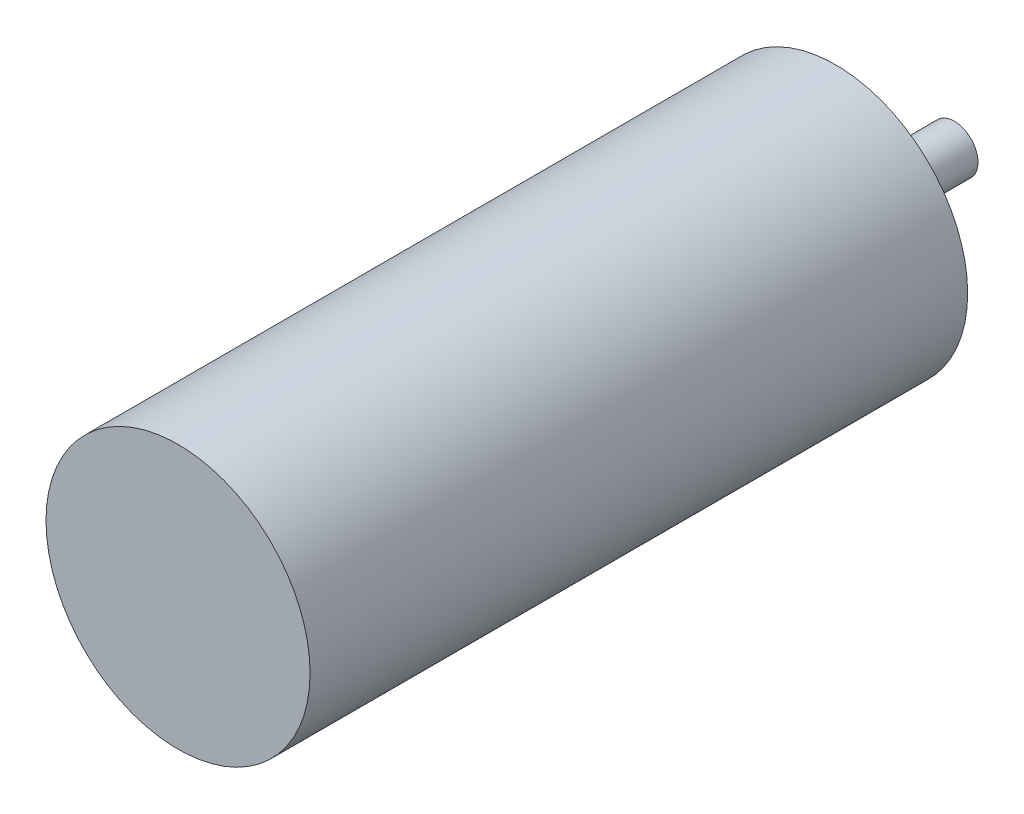
ISO-10303-21;
HEADER;
FILE_DESCRIPTION(('STEP AP214'),'2;1');
FILE_NAME('part.step','',(''),(''),'','','');
FILE_SCHEMA(('AUTOMOTIVE_DESIGN { 1 0 10303 214 1 1 1 1 }'));
ENDSEC;
DATA;
#1=APPLICATION_CONTEXT('core data for automotive mechanical design processes');
#2=APPLICATION_PROTOCOL_DEFINITION('international standard','automotive_design',2000,#1);
#3=PRODUCT_CONTEXT('',#1,'mechanical');
#4=PRODUCT('Part','Part','',(#3));
#5=PRODUCT_RELATED_PRODUCT_CATEGORY('part','',(#4));
#6=PRODUCT_DEFINITION_FORMATION('','',#4);
#7=PRODUCT_DEFINITION_CONTEXT('part definition',#1,'design');
#8=PRODUCT_DEFINITION('design','',#6,#7);
#9=PRODUCT_DEFINITION_SHAPE('','',#8);
#10=(LENGTH_UNIT() NAMED_UNIT(*) SI_UNIT(.MILLI.,.METRE.));
#11=(NAMED_UNIT(*) PLANE_ANGLE_UNIT() SI_UNIT($,.RADIAN.));
#12=(NAMED_UNIT(*) SI_UNIT($,.STERADIAN.) SOLID_ANGLE_UNIT());
#13=UNCERTAINTY_MEASURE_WITH_UNIT(LENGTH_MEASURE(1.E-05),#10,'distance_accuracy_value','');
#14=(GEOMETRIC_REPRESENTATION_CONTEXT(3) GLOBAL_UNCERTAINTY_ASSIGNED_CONTEXT((#13)) GLOBAL_UNIT_ASSIGNED_CONTEXT((#10,
#11,#12)) REPRESENTATION_CONTEXT('',''));
#15=CARTESIAN_POINT('',(0.,0.,0.));
#16=DIRECTION('',(0.,0.,1.));
#17=DIRECTION('',(1.,0.,0.));
#18=AXIS2_PLACEMENT_3D('',#15,#16,#17);
#19=CARTESIAN_POINT('',(0.,0.,110.79988));
#20=DIRECTION('',(0.,0.,-1.));
#21=DIRECTION('',(-1.,0.,0.));
#22=AXIS2_PLACEMENT_3D('',#19,#20,#21);
#23=CYLINDRICAL_SURFACE('',#22,22.25);
#24=CARTESIAN_POINT('',(0.,0.,110.79988));
#25=DIRECTION('',(0.,0.,1.));
#26=DIRECTION('',(1.,0.,0.));
#27=AXIS2_PLACEMENT_3D('',#24,#25,#26);
#28=CIRCLE('',#27,22.25);
#29=CARTESIAN_POINT('',(22.25,0.,110.79988));
#30=VERTEX_POINT('',#29);
#31=EDGE_CURVE('E46',#30,#30,#28,.T.);
#32=ORIENTED_EDGE('',*,*,#31,.F.);
#33=EDGE_LOOP('',(#32));
#34=FACE_BOUND('',#33,.T.);
#35=CARTESIAN_POINT('',(0.,0.,0.));
#36=DIRECTION('',(0.,0.,1.));
#37=DIRECTION('',(1.,0.,0.));
#38=AXIS2_PLACEMENT_3D('',#35,#36,#37);
#39=CIRCLE('',#38,22.25);
#40=CARTESIAN_POINT('',(22.25,0.,0.));
#41=VERTEX_POINT('',#40);
#42=EDGE_CURVE('E42',#41,#41,#39,.T.);
#43=ORIENTED_EDGE('',*,*,#42,.T.);
#44=EDGE_LOOP('',(#43));
#45=FACE_BOUND('',#44,.T.);
#46=ADVANCED_FACE('F39',(#34,#45),#23,.T.);
#47=CARTESIAN_POINT('',(0.,0.,110.79988));
#48=DIRECTION('',(0.,0.,1.));
#49=DIRECTION('',(1.,0.,0.));
#50=AXIS2_PLACEMENT_3D('',#47,#48,#49);
#51=PLANE('',#50);
#52=ORIENTED_EDGE('',*,*,#31,.T.);
#53=EDGE_LOOP('',(#52));
#54=FACE_BOUND('',#53,.T.);
#55=ADVANCED_FACE('F63',(#54),#51,.T.);
#56=CARTESIAN_POINT('',(0.,0.,0.));
#57=DIRECTION('',(0.,0.,1.));
#58=DIRECTION('',(1.,0.,0.));
#59=AXIS2_PLACEMENT_3D('',#56,#57,#58);
#60=PLANE('',#59);
#61=CARTESIAN_POINT('',(0.,0.,0.));
#62=DIRECTION('',(0.,0.,-1.));
#63=DIRECTION('',(-1.,0.,0.));
#64=AXIS2_PLACEMENT_3D('',#61,#62,#63);
#65=CIRCLE('',#64,4.);
#66=CARTESIAN_POINT('',(-4.,0.,0.));
#67=VERTEX_POINT('',#66);
#68=EDGE_CURVE('E10',#67,#67,#65,.T.);
#69=ORIENTED_EDGE('',*,*,#68,.F.);
#70=EDGE_LOOP('',(#69));
#71=FACE_BOUND('',#70,.T.);
#72=ORIENTED_EDGE('',*,*,#42,.F.);
#73=EDGE_LOOP('',(#72));
#74=FACE_BOUND('',#73,.T.);
#75=ADVANCED_FACE('F60',(#71,#74),#60,.F.);
#76=CARTESIAN_POINT('',(0.,0.,-20.));
#77=DIRECTION('',(0.,0.,1.));
#78=DIRECTION('',(1.,0.,0.));
#79=AXIS2_PLACEMENT_3D('',#76,#77,#78);
#80=CYLINDRICAL_SURFACE('',#79,4.);
#81=CARTESIAN_POINT('',(0.,0.,-20.));
#82=DIRECTION('',(0.,0.,-1.));
#83=DIRECTION('',(-1.,0.,0.));
#84=AXIS2_PLACEMENT_3D('',#81,#82,#83);
#85=CIRCLE('',#84,4.);
#86=CARTESIAN_POINT('',(-4.,0.,-20.));
#87=VERTEX_POINT('',#86);
#88=EDGE_CURVE('E52',#87,#87,#85,.T.);
#89=ORIENTED_EDGE('',*,*,#88,.F.);
#90=EDGE_LOOP('',(#89));
#91=FACE_BOUND('',#90,.T.);
#92=ORIENTED_EDGE('',*,*,#68,.T.);
#93=EDGE_LOOP('',(#92));
#94=FACE_BOUND('',#93,.T.);
#95=ADVANCED_FACE('F62',(#91,#94),#80,.T.);
#96=CARTESIAN_POINT('',(0.,0.,-20.));
#97=DIRECTION('',(0.,0.,-1.));
#98=DIRECTION('',(-1.,0.,0.));
#99=AXIS2_PLACEMENT_3D('',#96,#97,#98);
#100=PLANE('',#99);
#101=ORIENTED_EDGE('',*,*,#88,.T.);
#102=EDGE_LOOP('',(#101));
#103=FACE_BOUND('',#102,.T.);
#104=ADVANCED_FACE('F69',(#103),#100,.T.);
#105=CLOSED_SHELL('',(#46,#55,#75,#95,#104));
#106=MANIFOLD_SOLID_BREP('B2',#105);
#107=ADVANCED_BREP_SHAPE_REPRESENTATION('',(#18,#106),#14);
#108=SHAPE_DEFINITION_REPRESENTATION(#9,#107);
ENDSEC;
END-ISO-10303-21;
